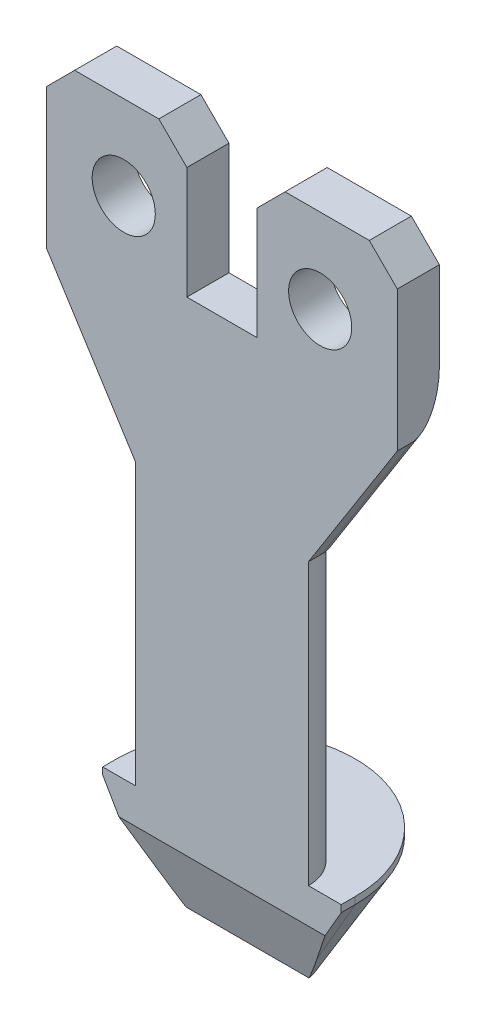
ISO-10303-21;
HEADER;
FILE_DESCRIPTION(('STEP AP214'),'2;1');
FILE_NAME('part.step','',(''),(''),'','','');
FILE_SCHEMA(('AUTOMOTIVE_DESIGN { 1 0 10303 214 1 1 1 1 }'));
ENDSEC;
DATA;
#1=APPLICATION_CONTEXT('core data for automotive mechanical design processes');
#2=APPLICATION_PROTOCOL_DEFINITION('international standard','automotive_design',2000,#1);
#3=PRODUCT_CONTEXT('',#1,'mechanical');
#4=PRODUCT('Part','Part','',(#3));
#5=PRODUCT_RELATED_PRODUCT_CATEGORY('part','',(#4));
#6=PRODUCT_DEFINITION_FORMATION('','',#4);
#7=PRODUCT_DEFINITION_CONTEXT('part definition',#1,'design');
#8=PRODUCT_DEFINITION('design','',#6,#7);
#9=PRODUCT_DEFINITION_SHAPE('','',#8);
#10=(LENGTH_UNIT() NAMED_UNIT(*) SI_UNIT(.MILLI.,.METRE.));
#11=(NAMED_UNIT(*) PLANE_ANGLE_UNIT() SI_UNIT($,.RADIAN.));
#12=(NAMED_UNIT(*) SI_UNIT($,.STERADIAN.) SOLID_ANGLE_UNIT());
#13=UNCERTAINTY_MEASURE_WITH_UNIT(LENGTH_MEASURE(1.E-05),#10,'distance_accuracy_value','');
#14=(GEOMETRIC_REPRESENTATION_CONTEXT(3) GLOBAL_UNCERTAINTY_ASSIGNED_CONTEXT((#13)) GLOBAL_UNIT_ASSIGNED_CONTEXT((#10,
#11,#12)) REPRESENTATION_CONTEXT('',''));
#15=CARTESIAN_POINT('',(0.,0.,0.));
#16=DIRECTION('',(0.,0.,1.));
#17=DIRECTION('',(1.,0.,0.));
#18=AXIS2_PLACEMENT_3D('',#15,#16,#17);
#19=CARTESIAN_POINT('',(0.,0.,3.));
#20=DIRECTION('',(0.,0.,-1.));
#21=DIRECTION('',(-1.,0.,0.));
#22=AXIS2_PLACEMENT_3D('',#19,#20,#21);
#23=PLANE('',#22);
#24=DIRECTION('',(0.,1.,0.));
#25=VECTOR('',#24,1.);
#26=CARTESIAN_POINT('',(5.68511481611491,-37.0594140712138,3.));
#27=LINE('',#26,#25);
#28=CARTESIAN_POINT('',(5.68511481611491,-37.0594140712138,3.));
#29=VERTEX_POINT('',#28);
#30=CARTESIAN_POINT('',(5.68511481611491,-17.0594140712138,3.));
#31=VERTEX_POINT('',#30);
#32=EDGE_CURVE('E243',#29,#31,#27,.T.);
#33=ORIENTED_EDGE('',*,*,#32,.T.);
#34=DIRECTION('',(0.535052081184345,0.844819075554229,0.));
#35=VECTOR('',#34,1.);
#36=CARTESIAN_POINT('',(5.6851148161149,-17.0594140712138,3.));
#37=LINE('',#36,#35);
#38=CARTESIAN_POINT('',(12.0184481494482,-7.05941407121384,3.));
#39=VERTEX_POINT('',#38);
#40=EDGE_CURVE('E225',#31,#39,#37,.T.);
#41=ORIENTED_EDGE('',*,*,#40,.T.);
#42=DIRECTION('',(0.,1.,0.));
#43=VECTOR('',#42,1.);
#44=CARTESIAN_POINT('',(12.0184481494482,-7.05941407121384,3.));
#45=LINE('',#44,#43);
#46=CARTESIAN_POINT('',(12.0184481494482,2.94058592878616,3.));
#47=VERTEX_POINT('',#46);
#48=EDGE_CURVE('E239',#39,#47,#45,.T.);
#49=ORIENTED_EDGE('',*,*,#48,.T.);
#50=DIRECTION('',(0.707106781186546,-0.707106781186549,0.));
#51=VECTOR('',#50,1.);
#52=CARTESIAN_POINT('',(10.0184481494482,4.94058592878616,3.));
#53=LINE('',#52,#51);
#54=CARTESIAN_POINT('',(10.0184481494482,4.94058592878616,3.));
#55=VERTEX_POINT('',#54);
#56=EDGE_CURVE('E436',#47,#55,#53,.F.);
#57=ORIENTED_EDGE('',*,*,#56,.T.);
#58=DIRECTION('',(-1.,0.,0.));
#59=VECTOR('',#58,1.);
#60=CARTESIAN_POINT('',(12.0184481494482,4.94058592878616,3.));
#61=LINE('',#60,#59);
#62=CARTESIAN_POINT('',(4.01844814944825,4.94058592878616,3.));
#63=VERTEX_POINT('',#62);
#64=EDGE_CURVE('E233',#55,#63,#61,.T.);
#65=ORIENTED_EDGE('',*,*,#64,.T.);
#66=DIRECTION('',(0.707106781186549,0.707106781186546,0.));
#67=VECTOR('',#66,1.);
#68=CARTESIAN_POINT('',(2.01844814944824,2.94058592878616,3.));
#69=LINE('',#68,#67);
#70=CARTESIAN_POINT('',(2.01844814944824,2.94058592878616,3.));
#71=VERTEX_POINT('',#70);
#72=EDGE_CURVE('E442',#63,#71,#69,.F.);
#73=ORIENTED_EDGE('',*,*,#72,.T.);
#74=DIRECTION('',(0.,-1.,0.));
#75=VECTOR('',#74,1.);
#76=CARTESIAN_POINT('',(2.01844814944824,4.94058592878616,3.));
#77=LINE('',#76,#75);
#78=CARTESIAN_POINT('',(2.01844814944824,-5.05941407121401,3.));
#79=VERTEX_POINT('',#78);
#80=EDGE_CURVE('E287',#71,#79,#77,.T.);
#81=ORIENTED_EDGE('',*,*,#80,.T.);
#82=DIRECTION('',(-1.,0.,0.));
#83=VECTOR('',#82,1.);
#84=CARTESIAN_POINT('',(2.01844814944824,-5.05941407121401,3.));
#85=LINE('',#84,#83);
#86=CARTESIAN_POINT('',(-2.98155185055176,-5.05941407121401,3.));
#87=VERTEX_POINT('',#86);
#88=EDGE_CURVE('E411',#79,#87,#85,.T.);
#89=ORIENTED_EDGE('',*,*,#88,.T.);
#90=DIRECTION('',(0.,1.,0.));
#91=VECTOR('',#90,1.);
#92=CARTESIAN_POINT('',(-2.98155185055176,-5.05941407121401,3.));
#93=LINE('',#92,#91);
#94=CARTESIAN_POINT('',(-2.98155185055176,2.94058592878616,3.));
#95=VERTEX_POINT('',#94);
#96=EDGE_CURVE('E414',#87,#95,#93,.T.);
#97=ORIENTED_EDGE('',*,*,#96,.T.);
#98=DIRECTION('',(0.707106781186545,-0.70710678118655,0.));
#99=VECTOR('',#98,1.);
#100=CARTESIAN_POINT('',(-4.98155185055176,4.94058592878616,3.));
#101=LINE('',#100,#99);
#102=CARTESIAN_POINT('',(-4.98155185055176,4.94058592878616,3.));
#103=VERTEX_POINT('',#102);
#104=EDGE_CURVE('E424',#95,#103,#101,.F.);
#105=ORIENTED_EDGE('',*,*,#104,.T.);
#106=DIRECTION('',(-1.,0.,0.));
#107=VECTOR('',#106,1.);
#108=CARTESIAN_POINT('',(-2.98155185055176,4.94058592878616,3.));
#109=LINE('',#108,#107);
#110=CARTESIAN_POINT('',(-10.9815518505518,4.94058592878616,3.));
#111=VERTEX_POINT('',#110);
#112=EDGE_CURVE('E259',#103,#111,#109,.T.);
#113=ORIENTED_EDGE('',*,*,#112,.T.);
#114=DIRECTION('',(0.707106781186549,0.707106781186546,0.));
#115=VECTOR('',#114,1.);
#116=CARTESIAN_POINT('',(-12.9815518505518,2.94058592878617,3.));
#117=LINE('',#116,#115);
#118=CARTESIAN_POINT('',(-12.9815518505518,2.94058592878617,3.));
#119=VERTEX_POINT('',#118);
#120=EDGE_CURVE('E421',#111,#119,#117,.F.);
#121=ORIENTED_EDGE('',*,*,#120,.T.);
#122=DIRECTION('',(0.,-1.,0.));
#123=VECTOR('',#122,1.);
#124=CARTESIAN_POINT('',(-12.9815518505518,4.94058592878616,3.));
#125=LINE('',#124,#123);
#126=CARTESIAN_POINT('',(-12.9815518505518,-7.05941407121384,3.));
#127=VERTEX_POINT('',#126);
#128=EDGE_CURVE('E252',#119,#127,#125,.T.);
#129=ORIENTED_EDGE('',*,*,#128,.T.);
#130=DIRECTION('',(0.535052081184345,-0.844819075554229,0.));
#131=VECTOR('',#130,1.);
#132=CARTESIAN_POINT('',(-12.9815518505518,-7.05941407121384,3.));
#133=LINE('',#132,#131);
#134=CARTESIAN_POINT('',(-6.64821851721843,-17.0594140712138,3.));
#135=VERTEX_POINT('',#134);
#136=EDGE_CURVE('E246',#127,#135,#133,.T.);
#137=ORIENTED_EDGE('',*,*,#136,.T.);
#138=DIRECTION('',(0.,-1.,0.));
#139=VECTOR('',#138,1.);
#140=CARTESIAN_POINT('',(-6.64821851721843,-37.0594140712138,3.));
#141=LINE('',#140,#139);
#142=CARTESIAN_POINT('',(-6.64821851721843,-37.0594140712138,3.));
#143=VERTEX_POINT('',#142);
#144=EDGE_CURVE('E326',#135,#143,#141,.T.);
#145=ORIENTED_EDGE('',*,*,#144,.T.);
#146=DIRECTION('',(-1.,0.,0.));
#147=VECTOR('',#146,1.);
#148=CARTESIAN_POINT('',(-6.64821851721843,-37.0594140712138,3.));
#149=LINE('',#148,#147);
#150=CARTESIAN_POINT('',(-8.98155185055176,-37.0594140712138,3.));
#151=VERTEX_POINT('',#150);
#152=EDGE_CURVE('E614',#143,#151,#149,.T.);
#153=ORIENTED_EDGE('',*,*,#152,.T.);
#154=DIRECTION('',(0.,1.,0.));
#155=VECTOR('',#154,1.);
#156=CARTESIAN_POINT('',(-8.98155185055176,-44.5594140712138,3.));
#157=LINE('',#156,#155);
#158=CARTESIAN_POINT('',(-8.98155185055176,-37.5594140712138,3.));
#159=VERTEX_POINT('',#158);
#160=EDGE_CURVE('E378',#159,#151,#157,.T.);
#161=ORIENTED_EDGE('',*,*,#160,.F.);
#162=DIRECTION('',(0.499999999999997,-0.86602540378444,0.));
#163=VECTOR('',#162,1.);
#164=CARTESIAN_POINT('',(-4.94009996622441,-44.5594140712138,3.));
#165=LINE('',#164,#163);
#166=CARTESIAN_POINT('',(-7.82685131217254,-39.5594140712138,3.));
#167=VERTEX_POINT('',#166);
#168=EDGE_CURVE('E310',#159,#167,#165,.T.);
#169=ORIENTED_EDGE('',*,*,#168,.T.);
#170=DIRECTION('',(1.,0.,0.));
#171=VECTOR('',#170,1.);
#172=CARTESIAN_POINT('',(3.97699626512088,-39.5594140712138,3.));
#173=LINE('',#172,#171);
#174=CARTESIAN_POINT('',(6.86374761106902,-39.5594140712138,3.));
#175=VERTEX_POINT('',#174);
#176=EDGE_CURVE('E576',#167,#175,#173,.T.);
#177=ORIENTED_EDGE('',*,*,#176,.T.);
#178=DIRECTION('',(0.499999999999997,0.86602540378444,0.));
#179=VECTOR('',#178,1.);
#180=CARTESIAN_POINT('',(3.97699626512088,-44.5594140712138,3.));
#181=LINE('',#180,#179);
#182=CARTESIAN_POINT('',(8.01844814944824,-37.5594140712138,3.));
#183=VERTEX_POINT('',#182);
#184=EDGE_CURVE('E307',#175,#183,#181,.T.);
#185=ORIENTED_EDGE('',*,*,#184,.T.);
#186=DIRECTION('',(0.,1.,0.));
#187=VECTOR('',#186,1.);
#188=CARTESIAN_POINT('',(8.01844814944824,-44.5594140712138,3.));
#189=LINE('',#188,#187);
#190=CARTESIAN_POINT('',(8.01844814944824,-37.0594140712138,3.));
#191=VERTEX_POINT('',#190);
#192=EDGE_CURVE('E382',#183,#191,#189,.T.);
#193=ORIENTED_EDGE('',*,*,#192,.T.);
#194=DIRECTION('',(-1.,0.,0.));
#195=VECTOR('',#194,1.);
#196=CARTESIAN_POINT('',(5.68511481611491,-37.0594140712138,3.));
#197=LINE('',#196,#195);
#198=EDGE_CURVE('E353',#191,#29,#197,.T.);
#199=ORIENTED_EDGE('',*,*,#198,.T.);
#200=EDGE_LOOP('',(#33,#41,#49,#57,#65,#73,#81,#89,#97,#105,#113,#121,#129,#137,#145,#153,#161,
#169,#177,#185,#193,#199));
#201=FACE_BOUND('',#200,.T.);
#202=CARTESIAN_POINT('',(6.51844814944824,-1.05941407121384,3.));
#203=DIRECTION('',(0.,0.,1.));
#204=DIRECTION('',(1.,0.,0.));
#205=AXIS2_PLACEMENT_3D('',#202,#203,#204);
#206=CIRCLE('',#205,2.25);
#207=CARTESIAN_POINT('',(8.76844814944824,-1.05941407121384,3.));
#208=VERTEX_POINT('',#207);
#209=EDGE_CURVE('E267',#208,#208,#206,.T.);
#210=ORIENTED_EDGE('',*,*,#209,.F.);
#211=EDGE_LOOP('',(#210));
#212=FACE_BOUND('',#211,.T.);
#213=CARTESIAN_POINT('',(-7.48155185055176,-1.05941407121384,3.));
#214=DIRECTION('',(0.,0.,1.));
#215=DIRECTION('',(1.,0.,0.));
#216=AXIS2_PLACEMENT_3D('',#213,#214,#215);
#217=CIRCLE('',#216,2.25);
#218=CARTESIAN_POINT('',(-5.23155185055176,-1.05941407121384,3.));
#219=VERTEX_POINT('',#218);
#220=EDGE_CURVE('E395',#219,#219,#217,.T.);
#221=ORIENTED_EDGE('',*,*,#220,.F.);
#222=EDGE_LOOP('',(#221));
#223=FACE_BOUND('',#222,.T.);
#224=ADVANCED_FACE('F47',(#201,#212,#223),#23,.F.);
#225=CARTESIAN_POINT('',(0.,0.,0.));
#226=DIRECTION('',(0.,0.,-1.));
#227=DIRECTION('',(-1.,0.,0.));
#228=AXIS2_PLACEMENT_3D('',#225,#226,#227);
#229=PLANE('',#228);
#230=DIRECTION('',(0.,1.,0.));
#231=VECTOR('',#230,1.);
#232=CARTESIAN_POINT('',(12.0184481494482,-7.05941407121384,0.));
#233=LINE('',#232,#231);
#234=CARTESIAN_POINT('',(12.0184481494482,-3.32146019656863,0.));
#235=VERTEX_POINT('',#234);
#236=CARTESIAN_POINT('',(12.0184481494482,2.94058592878616,0.));
#237=VERTEX_POINT('',#236);
#238=EDGE_CURVE('E281',#235,#237,#233,.T.);
#239=ORIENTED_EDGE('',*,*,#238,.F.);
#240=DIRECTION('',(0.535052081184345,0.844819075554229,0.));
#241=VECTOR('',#240,1.);
#242=CARTESIAN_POINT('',(3.99547666500644,-15.9893099088451,0.));
#243=LINE('',#242,#241);
#244=CARTESIAN_POINT('',(3.31774402883961,-17.0594140712138,0.));
#245=VERTEX_POINT('',#244);
#246=EDGE_CURVE('E593',#235,#245,#243,.F.);
#247=ORIENTED_EDGE('',*,*,#246,.T.);
#248=DIRECTION('',(1.,0.,0.));
#249=VECTOR('',#248,1.);
#250=CARTESIAN_POINT('',(5.68511481611491,-17.0594140712138,0.));
#251=LINE('',#250,#249);
#252=CARTESIAN_POINT('',(2.68511481611491,-17.0594140712138,0.));
#253=VERTEX_POINT('',#252);
#254=EDGE_CURVE('E358',#253,#245,#251,.T.);
#255=ORIENTED_EDGE('',*,*,#254,.F.);
#256=DIRECTION('',(0.,1.,0.));
#257=VECTOR('',#256,1.);
#258=CARTESIAN_POINT('',(2.68511481611491,-37.0594140712138,0.));
#259=LINE('',#258,#257);
#260=CARTESIAN_POINT('',(2.68511481611491,-37.0594140712138,0.));
#261=VERTEX_POINT('',#260);
#262=EDGE_CURVE('E334',#253,#261,#259,.F.);
#263=ORIENTED_EDGE('',*,*,#262,.T.);
#264=DIRECTION('',(1.,0.,0.));
#265=VECTOR('',#264,1.);
#266=CARTESIAN_POINT('',(-8.98155185055176,-37.0594140712138,0.));
#267=LINE('',#266,#265);
#268=CARTESIAN_POINT('',(-3.64821851721843,-37.0594140712138,0.));
#269=VERTEX_POINT('',#268);
#270=EDGE_CURVE('E389',#269,#261,#267,.T.);
#271=ORIENTED_EDGE('',*,*,#270,.F.);
#272=DIRECTION('',(0.,-1.,0.));
#273=VECTOR('',#272,1.);
#274=CARTESIAN_POINT('',(-3.64821851721843,-17.0594140712138,0.));
#275=LINE('',#274,#273);
#276=CARTESIAN_POINT('',(-3.64821851721843,-17.0594140712138,0.));
#277=VERTEX_POINT('',#276);
#278=EDGE_CURVE('E320',#269,#277,#275,.F.);
#279=ORIENTED_EDGE('',*,*,#278,.T.);
#280=DIRECTION('',(1.,0.,0.));
#281=VECTOR('',#280,1.);
#282=CARTESIAN_POINT('',(-6.64821851721843,-17.0594140712138,0.));
#283=LINE('',#282,#281);
#284=CARTESIAN_POINT('',(-4.28084772994314,-17.0594140712138,0.));
#285=VERTEX_POINT('',#284);
#286=EDGE_CURVE('E605',#285,#277,#283,.T.);
#287=ORIENTED_EDGE('',*,*,#286,.F.);
#288=DIRECTION('',(0.535052081184345,-0.844819075554229,0.));
#289=VECTOR('',#288,1.);
#290=CARTESIAN_POINT('',(-11.2919136994433,-5.98930990884515,0.));
#291=LINE('',#290,#289);
#292=CARTESIAN_POINT('',(-12.9815518505518,-3.32146019656863,0.));
#293=VERTEX_POINT('',#292);
#294=EDGE_CURVE('E590',#285,#293,#291,.F.);
#295=ORIENTED_EDGE('',*,*,#294,.T.);
#296=DIRECTION('',(0.,-1.,0.));
#297=VECTOR('',#296,1.);
#298=CARTESIAN_POINT('',(-12.9815518505518,4.94058592878616,0.));
#299=LINE('',#298,#297);
#300=CARTESIAN_POINT('',(-12.9815518505518,2.94058592878617,0.));
#301=VERTEX_POINT('',#300);
#302=EDGE_CURVE('E278',#301,#293,#299,.T.);
#303=ORIENTED_EDGE('',*,*,#302,.F.);
#304=DIRECTION('',(-0.707106781186549,-0.707106781186546,0.));
#305=VECTOR('',#304,1.);
#306=CARTESIAN_POINT('',(-7.96106888966894,7.96106888966897,0.));
#307=LINE('',#306,#305);
#308=CARTESIAN_POINT('',(-10.9815518505518,4.94058592878616,0.));
#309=VERTEX_POINT('',#308);
#310=EDGE_CURVE('E644',#301,#309,#307,.F.);
#311=ORIENTED_EDGE('',*,*,#310,.T.);
#312=DIRECTION('',(-1.,0.,0.));
#313=VECTOR('',#312,1.);
#314=CARTESIAN_POINT('',(-2.98155185055176,4.94058592878616,0.));
#315=LINE('',#314,#313);
#316=CARTESIAN_POINT('',(-4.98155185055176,4.94058592878616,0.));
#317=VERTEX_POINT('',#316);
#318=EDGE_CURVE('E274',#317,#309,#315,.T.);
#319=ORIENTED_EDGE('',*,*,#318,.F.);
#320=DIRECTION('',(-0.707106781186545,0.70710678118655,0.));
#321=VECTOR('',#320,1.);
#322=CARTESIAN_POINT('',(-0.0204829608828132,-0.0204829608828131,0.));
#323=LINE('',#322,#321);
#324=CARTESIAN_POINT('',(-2.98155185055176,2.94058592878616,0.));
#325=VERTEX_POINT('',#324);
#326=EDGE_CURVE('E657',#317,#325,#323,.F.);
#327=ORIENTED_EDGE('',*,*,#326,.T.);
#328=DIRECTION('',(0.,1.,0.));
#329=VECTOR('',#328,1.);
#330=CARTESIAN_POINT('',(-2.98155185055176,-5.05941407121401,0.));
#331=LINE('',#330,#329);
#332=CARTESIAN_POINT('',(-2.98155185055176,-5.05941407121401,0.));
#333=VERTEX_POINT('',#332);
#334=EDGE_CURVE('E270',#333,#325,#331,.T.);
#335=ORIENTED_EDGE('',*,*,#334,.F.);
#336=DIRECTION('',(-1.,0.,0.));
#337=VECTOR('',#336,1.);
#338=CARTESIAN_POINT('',(2.01844814944824,-5.05941407121401,0.));
#339=LINE('',#338,#337);
#340=CARTESIAN_POINT('',(2.01844814944824,-5.05941407121401,0.));
#341=VERTEX_POINT('',#340);
#342=EDGE_CURVE('E266',#341,#333,#339,.T.);
#343=ORIENTED_EDGE('',*,*,#342,.F.);
#344=DIRECTION('',(0.,-1.,0.));
#345=VECTOR('',#344,1.);
#346=CARTESIAN_POINT('',(2.01844814944824,4.94058592878616,0.));
#347=LINE('',#346,#345);
#348=CARTESIAN_POINT('',(2.01844814944824,2.94058592878616,0.));
#349=VERTEX_POINT('',#348);
#350=EDGE_CURVE('E263',#349,#341,#347,.T.);
#351=ORIENTED_EDGE('',*,*,#350,.F.);
#352=DIRECTION('',(-0.707106781186549,-0.707106781186546,0.));
#353=VECTOR('',#352,1.);
#354=CARTESIAN_POINT('',(-0.461068889668967,0.461068889668969,0.));
#355=LINE('',#354,#353);
#356=CARTESIAN_POINT('',(4.01844814944825,4.94058592878616,0.));
#357=VERTEX_POINT('',#356);
#358=EDGE_CURVE('E625',#349,#357,#355,.F.);
#359=ORIENTED_EDGE('',*,*,#358,.T.);
#360=DIRECTION('',(-1.,0.,0.));
#361=VECTOR('',#360,1.);
#362=CARTESIAN_POINT('',(12.0184481494482,4.94058592878616,0.));
#363=LINE('',#362,#361);
#364=CARTESIAN_POINT('',(10.0184481494482,4.94058592878616,0.));
#365=VERTEX_POINT('',#364);
#366=EDGE_CURVE('E284',#365,#357,#363,.T.);
#367=ORIENTED_EDGE('',*,*,#366,.F.);
#368=DIRECTION('',(-0.707106781186546,0.707106781186549,0.));
#369=VECTOR('',#368,1.);
#370=CARTESIAN_POINT('',(7.47951703911722,7.47951703911719,0.));
#371=LINE('',#370,#369);
#372=EDGE_CURVE('E640',#365,#237,#371,.F.);
#373=ORIENTED_EDGE('',*,*,#372,.T.);
#374=EDGE_LOOP('',(#239,#247,#255,#263,#271,#279,#287,#295,#303,#311,#319,#327,#335,#343,#351,
#359,#367,#373));
#375=FACE_BOUND('',#374,.T.);
#376=CARTESIAN_POINT('',(6.51844814944824,-1.05941407121384,0.));
#377=DIRECTION('',(0.,0.,1.));
#378=DIRECTION('',(1.,0.,0.));
#379=AXIS2_PLACEMENT_3D('',#376,#377,#378);
#380=CIRCLE('',#379,2.25);
#381=CARTESIAN_POINT('',(8.76844814944824,-1.05941407121384,0.));
#382=VERTEX_POINT('',#381);
#383=EDGE_CURVE('E399',#382,#382,#380,.T.);
#384=ORIENTED_EDGE('',*,*,#383,.T.);
#385=EDGE_LOOP('',(#384));
#386=FACE_BOUND('',#385,.T.);
#387=CARTESIAN_POINT('',(-7.48155185055176,-1.05941407121384,0.));
#388=DIRECTION('',(0.,0.,1.));
#389=DIRECTION('',(1.,0.,0.));
#390=AXIS2_PLACEMENT_3D('',#387,#388,#389);
#391=CIRCLE('',#390,2.25);
#392=CARTESIAN_POINT('',(-5.23155185055176,-1.05941407121384,0.));
#393=VERTEX_POINT('',#392);
#394=EDGE_CURVE('E394',#393,#393,#391,.T.);
#395=ORIENTED_EDGE('',*,*,#394,.T.);
#396=EDGE_LOOP('',(#395));
#397=FACE_BOUND('',#396,.T.);
#398=ADVANCED_FACE('F516',(#375,#386,#397),#229,.T.);
#399=CARTESIAN_POINT('',(2.01844814944824,4.94058592878616,3.));
#400=DIRECTION('',(1.,0.,0.));
#401=DIRECTION('',(0.,0.,-1.));
#402=AXIS2_PLACEMENT_3D('',#399,#400,#401);
#403=PLANE('',#402);
#404=ORIENTED_EDGE('',*,*,#80,.F.);
#405=DIRECTION('',(0.,0.,-1.));
#406=VECTOR('',#405,1.);
#407=CARTESIAN_POINT('',(2.01844814944824,2.94058592878616,3.));
#408=LINE('',#407,#406);
#409=EDGE_CURVE('E464',#71,#349,#408,.T.);
#410=ORIENTED_EDGE('',*,*,#409,.T.);
#411=ORIENTED_EDGE('',*,*,#350,.T.);
#412=DIRECTION('',(0.,0.,-1.));
#413=VECTOR('',#412,1.);
#414=CARTESIAN_POINT('',(2.01844814944824,-5.05941407121401,3.));
#415=LINE('',#414,#413);
#416=EDGE_CURVE('E295',#79,#341,#415,.T.);
#417=ORIENTED_EDGE('',*,*,#416,.F.);
#418=EDGE_LOOP('',(#404,#410,#411,#417));
#419=FACE_BOUND('',#418,.T.);
#420=ADVANCED_FACE('F521',(#419),#403,.F.);
#421=CARTESIAN_POINT('',(2.01844814944824,-5.05941407121401,3.));
#422=DIRECTION('',(0.,-1.,0.));
#423=DIRECTION('',(0.,0.,-1.));
#424=AXIS2_PLACEMENT_3D('',#421,#422,#423);
#425=PLANE('',#424);
#426=ORIENTED_EDGE('',*,*,#342,.T.);
#427=DIRECTION('',(0.,0.,-1.));
#428=VECTOR('',#427,1.);
#429=CARTESIAN_POINT('',(-2.98155185055176,-5.05941407121401,3.));
#430=LINE('',#429,#428);
#431=EDGE_CURVE('E291',#87,#333,#430,.T.);
#432=ORIENTED_EDGE('',*,*,#431,.F.);
#433=ORIENTED_EDGE('',*,*,#88,.F.);
#434=ORIENTED_EDGE('',*,*,#416,.T.);
#435=EDGE_LOOP('',(#426,#432,#433,#434));
#436=FACE_BOUND('',#435,.T.);
#437=ADVANCED_FACE('F543',(#436),#425,.F.);
#438=CARTESIAN_POINT('',(-2.98155185055176,-5.05941407121401,3.));
#439=DIRECTION('',(-1.,0.,0.));
#440=DIRECTION('',(0.,-1.,0.));
#441=AXIS2_PLACEMENT_3D('',#438,#439,#440);
#442=PLANE('',#441);
#443=ORIENTED_EDGE('',*,*,#334,.T.);
#444=DIRECTION('',(0.,0.,1.));
#445=VECTOR('',#444,1.);
#446=CARTESIAN_POINT('',(-2.98155185055176,2.94058592878616,3.));
#447=LINE('',#446,#445);
#448=EDGE_CURVE('E461',#325,#95,#447,.T.);
#449=ORIENTED_EDGE('',*,*,#448,.T.);
#450=ORIENTED_EDGE('',*,*,#96,.F.);
#451=ORIENTED_EDGE('',*,*,#431,.T.);
#452=EDGE_LOOP('',(#443,#449,#450,#451));
#453=FACE_BOUND('',#452,.T.);
#454=ADVANCED_FACE('F540',(#453),#442,.F.);
#455=CARTESIAN_POINT('',(-2.98155185055176,4.94058592878616,3.));
#456=DIRECTION('',(0.,-1.,0.));
#457=DIRECTION('',(0.,0.,-1.));
#458=AXIS2_PLACEMENT_3D('',#455,#456,#457);
#459=PLANE('',#458);
#460=ORIENTED_EDGE('',*,*,#318,.T.);
#461=DIRECTION('',(0.,0.,1.));
#462=VECTOR('',#461,1.);
#463=CARTESIAN_POINT('',(-10.9815518505518,4.94058592878616,3.));
#464=LINE('',#463,#462);
#465=EDGE_CURVE('E432',#309,#111,#464,.T.);
#466=ORIENTED_EDGE('',*,*,#465,.T.);
#467=ORIENTED_EDGE('',*,*,#112,.F.);
#468=DIRECTION('',(0.,0.,-1.));
#469=VECTOR('',#468,1.);
#470=CARTESIAN_POINT('',(-4.98155185055176,4.94058592878616,3.));
#471=LINE('',#470,#469);
#472=EDGE_CURVE('E456',#103,#317,#471,.T.);
#473=ORIENTED_EDGE('',*,*,#472,.T.);
#474=EDGE_LOOP('',(#460,#466,#467,#473));
#475=FACE_BOUND('',#474,.T.);
#476=ADVANCED_FACE('F537',(#475),#459,.F.);
#477=CARTESIAN_POINT('',(-12.9815518505518,4.94058592878616,3.));
#478=DIRECTION('',(1.,0.,0.));
#479=DIRECTION('',(0.,0.,-1.));
#480=AXIS2_PLACEMENT_3D('',#477,#478,#479);
#481=PLANE('',#480);
#482=ORIENTED_EDGE('',*,*,#302,.T.);
#483=CARTESIAN_POINT('',(-12.9815518505518,-3.32146019656863,2.));
#484=DIRECTION('',(1.,0.,0.));
#485=DIRECTION('',(0.,1.,0.));
#486=AXIS2_PLACEMENT_3D('',#483,#484,#485);
#487=ELLIPSE('',#486,3.7379538746452,2.);
#488=CARTESIAN_POINT('',(-12.9815518505518,-7.05941407121384,2.));
#489=VERTEX_POINT('',#488);
#490=EDGE_CURVE('E12',#293,#489,#487,.F.);
#491=ORIENTED_EDGE('',*,*,#490,.T.);
#492=DIRECTION('',(0.,0.,-1.));
#493=VECTOR('',#492,1.);
#494=CARTESIAN_POINT('',(-12.9815518505518,-7.05941407121384,3.));
#495=LINE('',#494,#493);
#496=EDGE_CURVE('E232',#127,#489,#495,.T.);
#497=ORIENTED_EDGE('',*,*,#496,.F.);
#498=ORIENTED_EDGE('',*,*,#128,.F.);
#499=DIRECTION('',(0.,0.,-1.));
#500=VECTOR('',#499,1.);
#501=CARTESIAN_POINT('',(-12.9815518505518,2.94058592878617,3.));
#502=LINE('',#501,#500);
#503=EDGE_CURVE('E434',#119,#301,#502,.T.);
#504=ORIENTED_EDGE('',*,*,#503,.T.);
#505=EDGE_LOOP('',(#482,#491,#497,#498,#504));
#506=FACE_BOUND('',#505,.T.);
#507=ADVANCED_FACE('F534',(#506),#481,.F.);
#508=CARTESIAN_POINT('',(12.0184481494482,-7.05941407121384,3.));
#509=DIRECTION('',(-1.,0.,0.));
#510=DIRECTION('',(0.,0.,1.));
#511=AXIS2_PLACEMENT_3D('',#508,#509,#510);
#512=PLANE('',#511);
#513=DIRECTION('',(0.,0.,-1.));
#514=VECTOR('',#513,1.);
#515=CARTESIAN_POINT('',(12.0184481494482,-7.05941407121384,3.));
#516=LINE('',#515,#514);
#517=CARTESIAN_POINT('',(12.0184481494482,-7.05941407121384,2.));
#518=VERTEX_POINT('',#517);
#519=EDGE_CURVE('E221',#39,#518,#516,.T.);
#520=ORIENTED_EDGE('',*,*,#519,.T.);
#521=CARTESIAN_POINT('',(12.0184481494482,-3.32146019656863,2.));
#522=DIRECTION('',(-1.,0.,0.));
#523=DIRECTION('',(0.,-1.,0.));
#524=AXIS2_PLACEMENT_3D('',#521,#522,#523);
#525=ELLIPSE('',#524,3.7379538746452,2.);
#526=EDGE_CURVE('E587',#518,#235,#525,.F.);
#527=ORIENTED_EDGE('',*,*,#526,.T.);
#528=ORIENTED_EDGE('',*,*,#238,.T.);
#529=DIRECTION('',(0.,0.,1.));
#530=VECTOR('',#529,1.);
#531=CARTESIAN_POINT('',(12.0184481494482,2.94058592878616,3.));
#532=LINE('',#531,#530);
#533=EDGE_CURVE('E250',#237,#47,#532,.T.);
#534=ORIENTED_EDGE('',*,*,#533,.T.);
#535=ORIENTED_EDGE('',*,*,#48,.F.);
#536=EDGE_LOOP('',(#520,#527,#528,#534,#535));
#537=FACE_BOUND('',#536,.T.);
#538=ADVANCED_FACE('F248',(#537),#512,.F.);
#539=CARTESIAN_POINT('',(12.0184481494482,4.94058592878616,3.));
#540=DIRECTION('',(0.,-1.,0.));
#541=DIRECTION('',(0.,0.,-1.));
#542=AXIS2_PLACEMENT_3D('',#539,#540,#541);
#543=PLANE('',#542);
#544=ORIENTED_EDGE('',*,*,#64,.F.);
#545=DIRECTION('',(0.,0.,-1.));
#546=VECTOR('',#545,1.);
#547=CARTESIAN_POINT('',(10.0184481494482,4.94058592878616,3.));
#548=LINE('',#547,#546);
#549=EDGE_CURVE('E448',#55,#365,#548,.T.);
#550=ORIENTED_EDGE('',*,*,#549,.T.);
#551=ORIENTED_EDGE('',*,*,#366,.T.);
#552=DIRECTION('',(0.,0.,1.));
#553=VECTOR('',#552,1.);
#554=CARTESIAN_POINT('',(4.01844814944825,4.94058592878616,3.));
#555=LINE('',#554,#553);
#556=EDGE_CURVE('E440',#357,#63,#555,.T.);
#557=ORIENTED_EDGE('',*,*,#556,.T.);
#558=EDGE_LOOP('',(#544,#550,#551,#557));
#559=FACE_BOUND('',#558,.T.);
#560=ADVANCED_FACE('F528',(#559),#543,.F.);
#561=CARTESIAN_POINT('',(6.51844814944824,-1.05941407121384,3.));
#562=DIRECTION('',(0.,0.,-1.));
#563=DIRECTION('',(-1.,0.,0.));
#564=AXIS2_PLACEMENT_3D('',#561,#562,#563);
#565=CYLINDRICAL_SURFACE('',#564,2.25);
#566=ORIENTED_EDGE('',*,*,#209,.T.);
#567=EDGE_LOOP('',(#566));
#568=FACE_BOUND('',#567,.T.);
#569=ORIENTED_EDGE('',*,*,#383,.F.);
#570=EDGE_LOOP('',(#569));
#571=FACE_BOUND('',#570,.T.);
#572=ADVANCED_FACE('F525',(#568,#571),#565,.F.);
#573=CARTESIAN_POINT('',(-7.48155185055176,-1.05941407121384,3.));
#574=DIRECTION('',(0.,0.,-1.));
#575=DIRECTION('',(-1.,0.,0.));
#576=AXIS2_PLACEMENT_3D('',#573,#574,#575);
#577=CYLINDRICAL_SURFACE('',#576,2.25);
#578=ORIENTED_EDGE('',*,*,#220,.T.);
#579=EDGE_LOOP('',(#578));
#580=FACE_BOUND('',#579,.T.);
#581=ORIENTED_EDGE('',*,*,#394,.F.);
#582=EDGE_LOOP('',(#581));
#583=FACE_BOUND('',#582,.T.);
#584=ADVANCED_FACE('F740',(#580,#583),#577,.F.);
#585=CARTESIAN_POINT('',(-0.481551850551761,-37.0594140712138,2.));
#586=DIRECTION('',(0.,-1.,0.));
#587=DIRECTION('',(0.,0.,-1.));
#588=AXIS2_PLACEMENT_3D('',#585,#586,#587);
#589=PLANE('',#588);
#590=CARTESIAN_POINT('',(-0.481551850551761,-37.0594140712138,2.));
#591=DIRECTION('',(0.,-1.,0.));
#592=DIRECTION('',(0.,0.,-1.));
#593=AXIS2_PLACEMENT_3D('',#590,#591,#592);
#594=CIRCLE('',#593,8.5);
#595=CARTESIAN_POINT('',(-8.98155185055176,-37.0594140712138,2.));
#596=VERTEX_POINT('',#595);
#597=CARTESIAN_POINT('',(8.01844814944824,-37.0594140712138,2.));
#598=VERTEX_POINT('',#597);
#599=EDGE_CURVE('E299',#596,#598,#594,.T.);
#600=ORIENTED_EDGE('',*,*,#599,.F.);
#601=DIRECTION('',(0.,0.,-1.));
#602=VECTOR('',#601,1.);
#603=CARTESIAN_POINT('',(-8.98155185055176,-37.0594140712138,2.));
#604=LINE('',#603,#602);
#605=EDGE_CURVE('E369',#151,#596,#604,.T.);
#606=ORIENTED_EDGE('',*,*,#605,.F.);
#607=ORIENTED_EDGE('',*,*,#152,.F.);
#608=CARTESIAN_POINT('',(-3.64821851721843,-37.0594140712138,3.));
#609=DIRECTION('',(0.,-1.,0.));
#610=DIRECTION('',(0.,0.,-1.));
#611=AXIS2_PLACEMENT_3D('',#608,#609,#610);
#612=CIRCLE('',#611,3.);
#613=EDGE_CURVE('E345',#143,#269,#612,.T.);
#614=ORIENTED_EDGE('',*,*,#613,.T.);
#615=ORIENTED_EDGE('',*,*,#270,.T.);
#616=CARTESIAN_POINT('',(2.68511481611491,-37.0594140712138,3.));
#617=DIRECTION('',(0.,-1.,0.));
#618=DIRECTION('',(0.,0.,-1.));
#619=AXIS2_PLACEMENT_3D('',#616,#617,#618);
#620=CIRCLE('',#619,3.);
#621=EDGE_CURVE('E341',#261,#29,#620,.T.);
#622=ORIENTED_EDGE('',*,*,#621,.T.);
#623=ORIENTED_EDGE('',*,*,#198,.F.);
#624=DIRECTION('',(0.,0.,1.));
#625=VECTOR('',#624,1.);
#626=CARTESIAN_POINT('',(8.01844814944824,-37.0594140712138,3.));
#627=LINE('',#626,#625);
#628=EDGE_CURVE('E330',#598,#191,#627,.T.);
#629=ORIENTED_EDGE('',*,*,#628,.F.);
#630=EDGE_LOOP('',(#600,#606,#607,#614,#615,#622,#623,#629));
#631=FACE_BOUND('',#630,.T.);
#632=ADVANCED_FACE('F719',(#631),#589,.F.);
#633=CARTESIAN_POINT('',(-0.481551850551761,-44.5594140712138,2.));
#634=DIRECTION('',(0.,1.,0.));
#635=DIRECTION('',(0.,0.,1.));
#636=AXIS2_PLACEMENT_3D('',#633,#634,#635);
#637=CYLINDRICAL_SURFACE('',#636,8.5);
#638=DIRECTION('',(0.,1.,0.));
#639=VECTOR('',#638,1.);
#640=CARTESIAN_POINT('',(8.01844814944824,-44.5594140712138,2.));
#641=LINE('',#640,#639);
#642=CARTESIAN_POINT('',(8.01844814944824,-37.5594140712138,2.));
#643=VERTEX_POINT('',#642);
#644=EDGE_CURVE('E386',#643,#598,#641,.T.);
#645=ORIENTED_EDGE('',*,*,#644,.F.);
#646=CARTESIAN_POINT('',(-0.481551850551761,-37.5594140712138,2.));
#647=DIRECTION('',(0.,-1.,0.));
#648=DIRECTION('',(0.,0.,-1.));
#649=AXIS2_PLACEMENT_3D('',#646,#647,#648);
#650=CIRCLE('',#649,8.5);
#651=CARTESIAN_POINT('',(-8.98155185055176,-37.5594140712138,2.));
#652=VERTEX_POINT('',#651);
#653=EDGE_CURVE('E317',#643,#652,#650,.F.);
#654=ORIENTED_EDGE('',*,*,#653,.T.);
#655=DIRECTION('',(0.,1.,0.));
#656=VECTOR('',#655,1.);
#657=CARTESIAN_POINT('',(-8.98155185055176,-44.5594140712138,2.));
#658=LINE('',#657,#656);
#659=EDGE_CURVE('E374',#652,#596,#658,.T.);
#660=ORIENTED_EDGE('',*,*,#659,.T.);
#661=ORIENTED_EDGE('',*,*,#599,.T.);
#662=EDGE_LOOP('',(#645,#654,#660,#661));
#663=FACE_BOUND('',#662,.T.);
#664=ADVANCED_FACE('F715',(#663),#637,.T.);
#665=CARTESIAN_POINT('',(8.01844814944824,-44.5594140712138,3.));
#666=DIRECTION('',(-1.,0.,0.));
#667=DIRECTION('',(0.,0.,1.));
#668=AXIS2_PLACEMENT_3D('',#665,#666,#667);
#669=PLANE('',#668);
#670=ORIENTED_EDGE('',*,*,#192,.F.);
#671=DIRECTION('',(0.,0.,-1.));
#672=VECTOR('',#671,1.);
#673=CARTESIAN_POINT('',(8.01844814944824,-37.5594140712138,2.));
#674=LINE('',#673,#672);
#675=EDGE_CURVE('E314',#183,#643,#674,.T.);
#676=ORIENTED_EDGE('',*,*,#675,.T.);
#677=ORIENTED_EDGE('',*,*,#644,.T.);
#678=ORIENTED_EDGE('',*,*,#628,.T.);
#679=EDGE_LOOP('',(#670,#676,#677,#678));
#680=FACE_BOUND('',#679,.T.);
#681=ADVANCED_FACE('F723',(#680),#669,.F.);
#682=CARTESIAN_POINT('',(-8.98155185055176,-44.5594140712138,2.));
#683=DIRECTION('',(1.,0.,0.));
#684=DIRECTION('',(0.,0.,-1.));
#685=AXIS2_PLACEMENT_3D('',#682,#683,#684);
#686=PLANE('',#685);
#687=ORIENTED_EDGE('',*,*,#659,.F.);
#688=DIRECTION('',(0.,0.,1.));
#689=VECTOR('',#688,1.);
#690=CARTESIAN_POINT('',(-8.98155185055176,-37.5594140712138,3.));
#691=LINE('',#690,#689);
#692=EDGE_CURVE('E304',#652,#159,#691,.T.);
#693=ORIENTED_EDGE('',*,*,#692,.T.);
#694=ORIENTED_EDGE('',*,*,#160,.T.);
#695=ORIENTED_EDGE('',*,*,#605,.T.);
#696=EDGE_LOOP('',(#687,#693,#694,#695));
#697=FACE_BOUND('',#696,.T.);
#698=ADVANCED_FACE('F703',(#697),#686,.F.);
#699=CARTESIAN_POINT('',(-0.481551850551761,-44.5594140712138,2.));
#700=DIRECTION('',(0.,-1.,0.));
#701=DIRECTION('',(0.,0.,-1.));
#702=AXIS2_PLACEMENT_3D('',#699,#700,#701);
#703=PLANE('',#702);
#704=CARTESIAN_POINT('',(-0.481551850551761,-44.5594140712138,2.));
#705=DIRECTION('',(0.,-1.,0.));
#706=DIRECTION('',(0.,0.,-1.));
#707=AXIS2_PLACEMENT_3D('',#704,#705,#706);
#708=CIRCLE('',#707,4.45854811567265);
#709=CARTESIAN_POINT('',(-4.86407342569948,-44.5594140712138,1.18014882866899));
#710=VERTEX_POINT('',#709);
#711=CARTESIAN_POINT('',(3.90096972459596,-44.5594140712138,1.18014882866899));
#712=VERTEX_POINT('',#711);
#713=EDGE_CURVE('E300',#710,#712,#708,.T.);
#714=ORIENTED_EDGE('',*,*,#713,.T.);
#715=DIRECTION('',(-1.,0.,0.));
#716=VECTOR('',#715,1.);
#717=CARTESIAN_POINT('',(-4.94009996622441,-44.5594140712138,1.18014882866899));
#718=LINE('',#717,#716);
#719=EDGE_CURVE('E468',#712,#710,#718,.T.);
#720=ORIENTED_EDGE('',*,*,#719,.T.);
#721=EDGE_LOOP('',(#714,#720));
#722=FACE_BOUND('',#721,.T.);
#723=ADVANCED_FACE('F698',(#722),#703,.T.);
#724=CARTESIAN_POINT('',(3.97699626512088,-44.5594140712138,2.));
#725=DIRECTION('',(0.86602540378444,-0.499999999999997,0.));
#726=DIRECTION('',(0.,0.,-1.));
#727=AXIS2_PLACEMENT_3D('',#724,#725,#726);
#728=PLANE('',#727);
#729=ORIENTED_EDGE('',*,*,#184,.F.);
#730=DIRECTION('',(-0.476870962711472,-0.825964736070558,-0.30062657848322));
#731=VECTOR('',#730,1.);
#732=CARTESIAN_POINT('',(4.09453019946643,-44.3558393253139,1.25424397662488));
#733=LINE('',#732,#731);
#734=CARTESIAN_POINT('',(5.27749078335447,-42.3068914906684,2.));
#735=VERTEX_POINT('',#734);
#736=EDGE_CURVE('E580',#175,#735,#733,.T.);
#737=ORIENTED_EDGE('',*,*,#736,.T.);
#738=DIRECTION('',(-0.499999999999997,-0.86602540378444,0.));
#739=VECTOR('',#738,1.);
#740=CARTESIAN_POINT('',(8.01844814944824,-37.5594140712138,2.));
#741=LINE('',#740,#739);
#742=EDGE_CURVE('E325',#643,#735,#741,.T.);
#743=ORIENTED_EDGE('',*,*,#742,.F.);
#744=ORIENTED_EDGE('',*,*,#675,.F.);
#745=EDGE_LOOP('',(#729,#737,#743,#744));
#746=FACE_BOUND('',#745,.T.);
#747=ADVANCED_FACE('F565',(#746),#728,.T.);
#748=CARTESIAN_POINT('',(-0.481551850551761,-44.5594140712138,2.));
#749=DIRECTION('',(0.,1.,0.));
#750=DIRECTION('',(0.,0.,1.));
#751=AXIS2_PLACEMENT_3D('',#748,#749,#750);
#752=CONICAL_SURFACE('',#751,4.45854811567265,0.523598775598296);
#753=ORIENTED_EDGE('',*,*,#713,.F.);
#754=CARTESIAN_POINT('',(-4.86407342569948,-44.5594140712138,1.18014882866899));
#755=CARTESIAN_POINT('',(-4.98488047898732,-44.3750410706528,1.24725511287553));
#756=CARTESIAN_POINT('',(-5.10381300006642,-44.1895969441273,1.31475125505032));
#757=CARTESIAN_POINT('',(-5.33845906776741,-43.8169632330287,1.45037883417437));
#758=CARTESIAN_POINT('',(-5.45417320374733,-43.6297739765228,1.51851015171693));
#759=CARTESIAN_POINT('',(-5.68294949919129,-43.2539904240196,1.65528417935491));
#760=CARTESIAN_POINT('',(-5.79601182570058,-43.0653962175156,1.7239268568774));
#761=CARTESIAN_POINT('',(-6.01989469071671,-42.6869901965478,1.86165538497682));
#762=CARTESIAN_POINT('',(-6.1307148135827,-42.497178164769,1.93074131464989));
#763=CARTESIAN_POINT('',(-6.24059448445799,-42.3068914906684,2.));
#764=B_SPLINE_CURVE_WITH_KNOTS('',3,(#754,#755,#756,#757,#758,#759,#760,#761,#762,#763),
.UNSPECIFIED.,.F.,.F.,(4,2,2,2,4),(0.,0.691216604697212,1.3823057875314,2.07335131906891,
2.76452379839814),.UNSPECIFIED.);
#765=CARTESIAN_POINT('',(-6.24059448445799,-42.3068914906684,2.));
#766=VERTEX_POINT('',#765);
#767=EDGE_CURVE('E481',#710,#766,#764,.T.);
#768=ORIENTED_EDGE('',*,*,#767,.T.);
#769=DIRECTION('',(0.499999999999997,-0.86602540378444,0.));
#770=VECTOR('',#769,1.);
#771=CARTESIAN_POINT('',(-8.98155185055176,-37.5594140712138,2.));
#772=LINE('',#771,#770);
#773=EDGE_CURVE('E321',#652,#766,#772,.T.);
#774=ORIENTED_EDGE('',*,*,#773,.F.);
#775=ORIENTED_EDGE('',*,*,#653,.F.);
#776=ORIENTED_EDGE('',*,*,#742,.T.);
#777=CARTESIAN_POINT('',(5.27749078335447,-42.3068914906684,2.));
#778=CARTESIAN_POINT('',(5.16761111247918,-42.497178164769,1.93074131464989));
#779=CARTESIAN_POINT('',(5.05679098961318,-42.6869901965478,1.86165538497682));
#780=CARTESIAN_POINT('',(4.83290812459706,-43.0653962175156,1.7239268568774));
#781=CARTESIAN_POINT('',(4.71984579808776,-43.2539904240196,1.65528417935491));
#782=CARTESIAN_POINT('',(4.49106950264381,-43.6297739765228,1.51851015171694));
#783=CARTESIAN_POINT('',(4.37535536666389,-43.8169632330287,1.45037883417438));
#784=CARTESIAN_POINT('',(4.1407092989629,-44.1895969441273,1.31475125505032));
#785=CARTESIAN_POINT('',(4.02177677788379,-44.3750410706528,1.24725511287553));
#786=CARTESIAN_POINT('',(3.90096972459596,-44.5594140712138,1.18014882866899));
#787=B_SPLINE_CURVE_WITH_KNOTS('',3,(#777,#778,#779,#780,#781,#782,#783,#784,#785,#786),
.UNSPECIFIED.,.F.,.F.,(4,2,2,2,4),(0.,0.691172479329244,1.38221801086674,2.07330719370091,
2.76452379839814),.UNSPECIFIED.);
#788=EDGE_CURVE('E472',#735,#712,#787,.T.);
#789=ORIENTED_EDGE('',*,*,#788,.T.);
#790=EDGE_LOOP('',(#753,#768,#774,#775,#776,#789));
#791=FACE_BOUND('',#790,.T.);
#792=ADVANCED_FACE('F488',(#791),#752,.T.);
#793=CARTESIAN_POINT('',(-4.94009996622441,-44.5594140712138,2.));
#794=DIRECTION('',(-0.86602540378444,-0.499999999999997,0.));
#795=DIRECTION('',(0.,0.,1.));
#796=AXIS2_PLACEMENT_3D('',#793,#794,#795);
#797=PLANE('',#796);
#798=ORIENTED_EDGE('',*,*,#773,.T.);
#799=DIRECTION('',(-0.476870962711472,0.825964736070558,0.30062657848322));
#800=VECTOR('',#799,1.);
#801=CARTESIAN_POINT('',(-5.05763390056995,-44.3558393253139,1.25424397662488));
#802=LINE('',#801,#800);
#803=EDGE_CURVE('E571',#766,#167,#802,.T.);
#804=ORIENTED_EDGE('',*,*,#803,.T.);
#805=ORIENTED_EDGE('',*,*,#168,.F.);
#806=ORIENTED_EDGE('',*,*,#692,.F.);
#807=EDGE_LOOP('',(#798,#804,#805,#806));
#808=FACE_BOUND('',#807,.T.);
#809=ADVANCED_FACE('F551',(#808),#797,.T.);
#810=CARTESIAN_POINT('',(-6.64821851721843,-17.0594140712138,3.));
#811=DIRECTION('',(0.,1.,0.));
#812=DIRECTION('',(0.,0.,1.));
#813=AXIS2_PLACEMENT_3D('',#810,#811,#812);
#814=PLANE('',#813);
#815=DIRECTION('',(0.,0.,-1.));
#816=VECTOR('',#815,1.);
#817=CARTESIAN_POINT('',(-6.64821851721843,-17.0594140712138,3.));
#818=LINE('',#817,#816);
#819=CARTESIAN_POINT('',(-6.64821851721843,-17.0594140712138,2.));
#820=VERTEX_POINT('',#819);
#821=EDGE_CURVE('E606',#135,#820,#818,.T.);
#822=ORIENTED_EDGE('',*,*,#821,.T.);
#823=CARTESIAN_POINT('',(-4.28084772994314,-17.0594140712138,2.));
#824=DIRECTION('',(0.,1.,0.));
#825=DIRECTION('',(-1.,0.,0.));
#826=AXIS2_PLACEMENT_3D('',#823,#824,#825);
#827=ELLIPSE('',#826,2.36737078727529,2.);
#828=EDGE_CURVE('E56',#820,#285,#827,.F.);
#829=ORIENTED_EDGE('',*,*,#828,.T.);
#830=ORIENTED_EDGE('',*,*,#286,.T.);
#831=CARTESIAN_POINT('',(-3.64821851721843,-17.0594140712138,3.));
#832=DIRECTION('',(0.,1.,0.));
#833=DIRECTION('',(0.,0.,1.));
#834=AXIS2_PLACEMENT_3D('',#831,#832,#833);
#835=CIRCLE('',#834,3.);
#836=EDGE_CURVE('E622',#277,#135,#835,.T.);
#837=ORIENTED_EDGE('',*,*,#836,.T.);
#838=EDGE_LOOP('',(#822,#829,#830,#837));
#839=FACE_BOUND('',#838,.T.);
#840=ADVANCED_FACE('F556',(#839),#814,.F.);
#841=CARTESIAN_POINT('',(5.68511481611491,-17.0594140712138,3.));
#842=DIRECTION('',(0.,1.,0.));
#843=DIRECTION('',(0.,0.,1.));
#844=AXIS2_PLACEMENT_3D('',#841,#842,#843);
#845=PLANE('',#844);
#846=ORIENTED_EDGE('',*,*,#254,.T.);
#847=CARTESIAN_POINT('',(3.31774402883961,-17.0594140712138,2.));
#848=DIRECTION('',(0.,1.,0.));
#849=DIRECTION('',(-1.,0.,0.));
#850=AXIS2_PLACEMENT_3D('',#847,#848,#849);
#851=ELLIPSE('',#850,2.36737078727529,2.);
#852=CARTESIAN_POINT('',(5.6851148161149,-17.0594140712138,2.));
#853=VERTEX_POINT('',#852);
#854=EDGE_CURVE('E596',#245,#853,#851,.F.);
#855=ORIENTED_EDGE('',*,*,#854,.T.);
#856=DIRECTION('',(0.,0.,-1.));
#857=VECTOR('',#856,1.);
#858=CARTESIAN_POINT('',(5.6851148161149,-17.0594140712138,3.));
#859=LINE('',#858,#857);
#860=EDGE_CURVE('E245',#31,#853,#859,.T.);
#861=ORIENTED_EDGE('',*,*,#860,.F.);
#862=CARTESIAN_POINT('',(2.68511481611491,-17.0594140712138,3.));
#863=DIRECTION('',(0.,1.,0.));
#864=DIRECTION('',(0.,0.,1.));
#865=AXIS2_PLACEMENT_3D('',#862,#863,#864);
#866=CIRCLE('',#865,3.);
#867=EDGE_CURVE('E337',#31,#253,#866,.T.);
#868=ORIENTED_EDGE('',*,*,#867,.T.);
#869=EDGE_LOOP('',(#846,#855,#861,#868));
#870=FACE_BOUND('',#869,.T.);
#871=ADVANCED_FACE('F562',(#870),#845,.F.);
#872=CARTESIAN_POINT('',(2.68511481611491,-37.0594140712138,3.));
#873=DIRECTION('',(0.,-1.,0.));
#874=DIRECTION('',(1.,0.,0.));
#875=AXIS2_PLACEMENT_3D('',#872,#873,#874);
#876=CYLINDRICAL_SURFACE('',#875,3.);
#877=ORIENTED_EDGE('',*,*,#621,.F.);
#878=ORIENTED_EDGE('',*,*,#262,.F.);
#879=ORIENTED_EDGE('',*,*,#867,.F.);
#880=ORIENTED_EDGE('',*,*,#32,.F.);
#881=EDGE_LOOP('',(#877,#878,#879,#880));
#882=FACE_BOUND('',#881,.T.);
#883=ADVANCED_FACE('F691',(#882),#876,.T.);
#884=CARTESIAN_POINT('',(-3.64821851721843,-37.0594140712138,3.));
#885=DIRECTION('',(0.,1.,0.));
#886=DIRECTION('',(-1.,0.,0.));
#887=AXIS2_PLACEMENT_3D('',#884,#885,#886);
#888=CYLINDRICAL_SURFACE('',#887,3.);
#889=ORIENTED_EDGE('',*,*,#836,.F.);
#890=ORIENTED_EDGE('',*,*,#278,.F.);
#891=ORIENTED_EDGE('',*,*,#613,.F.);
#892=ORIENTED_EDGE('',*,*,#144,.F.);
#893=EDGE_LOOP('',(#889,#890,#891,#892));
#894=FACE_BOUND('',#893,.T.);
#895=ADVANCED_FACE('F626',(#894),#888,.T.);
#896=CARTESIAN_POINT('',(10.0184481494482,4.94058592878616,3.));
#897=DIRECTION('',(-0.707106781186549,-0.707106781186546,0.));
#898=DIRECTION('',(0.,0.,-1.));
#899=AXIS2_PLACEMENT_3D('',#896,#897,#898);
#900=PLANE('',#899);
#901=ORIENTED_EDGE('',*,*,#56,.F.);
#902=ORIENTED_EDGE('',*,*,#533,.F.);
#903=ORIENTED_EDGE('',*,*,#372,.F.);
#904=ORIENTED_EDGE('',*,*,#549,.F.);
#905=EDGE_LOOP('',(#901,#902,#903,#904));
#906=FACE_BOUND('',#905,.T.);
#907=ADVANCED_FACE('F646',(#906),#900,.F.);
#908=CARTESIAN_POINT('',(-12.9815518505518,2.94058592878617,3.));
#909=DIRECTION('',(0.707106781186546,-0.707106781186549,0.));
#910=DIRECTION('',(0.,0.,-1.));
#911=AXIS2_PLACEMENT_3D('',#908,#909,#910);
#912=PLANE('',#911);
#913=ORIENTED_EDGE('',*,*,#120,.F.);
#914=ORIENTED_EDGE('',*,*,#465,.F.);
#915=ORIENTED_EDGE('',*,*,#310,.F.);
#916=ORIENTED_EDGE('',*,*,#503,.F.);
#917=EDGE_LOOP('',(#913,#914,#915,#916));
#918=FACE_BOUND('',#917,.T.);
#919=ADVANCED_FACE('F431',(#918),#912,.F.);
#920=CARTESIAN_POINT('',(-4.98155185055176,4.94058592878616,3.));
#921=DIRECTION('',(-0.70710678118655,-0.707106781186545,0.));
#922=DIRECTION('',(0.,0.,-1.));
#923=AXIS2_PLACEMENT_3D('',#920,#921,#922);
#924=PLANE('',#923);
#925=ORIENTED_EDGE('',*,*,#104,.F.);
#926=ORIENTED_EDGE('',*,*,#448,.F.);
#927=ORIENTED_EDGE('',*,*,#326,.F.);
#928=ORIENTED_EDGE('',*,*,#472,.F.);
#929=EDGE_LOOP('',(#925,#926,#927,#928));
#930=FACE_BOUND('',#929,.T.);
#931=ADVANCED_FACE('F670',(#930),#924,.F.);
#932=CARTESIAN_POINT('',(2.01844814944824,2.94058592878616,3.));
#933=DIRECTION('',(0.707106781186546,-0.707106781186549,0.));
#934=DIRECTION('',(0.,0.,-1.));
#935=AXIS2_PLACEMENT_3D('',#932,#933,#934);
#936=PLANE('',#935);
#937=ORIENTED_EDGE('',*,*,#72,.F.);
#938=ORIENTED_EDGE('',*,*,#556,.F.);
#939=ORIENTED_EDGE('',*,*,#358,.F.);
#940=ORIENTED_EDGE('',*,*,#409,.F.);
#941=EDGE_LOOP('',(#937,#938,#939,#940));
#942=FACE_BOUND('',#941,.T.);
#943=ADVANCED_FACE('F500',(#942),#936,.F.);
#944=CARTESIAN_POINT('',(-0.481551850551761,-44.5594140712138,1.18014882866899));
#945=DIRECTION('',(0.,-0.342020143325666,0.939692620785909));
#946=DIRECTION('',(1.,0.,0.));
#947=AXIS2_PLACEMENT_3D('',#944,#945,#946);
#948=PLANE('',#947);
#949=ORIENTED_EDGE('',*,*,#736,.F.);
#950=ORIENTED_EDGE('',*,*,#176,.F.);
#951=ORIENTED_EDGE('',*,*,#803,.F.);
#952=ORIENTED_EDGE('',*,*,#767,.F.);
#953=ORIENTED_EDGE('',*,*,#719,.F.);
#954=ORIENTED_EDGE('',*,*,#788,.F.);
#955=EDGE_LOOP('',(#949,#950,#951,#952,#953,#954));
#956=FACE_BOUND('',#955,.T.);
#957=ADVANCED_FACE('F493',(#956),#948,.T.);
#958=CARTESIAN_POINT('',(5.6851148161149,-17.0594140712138,3.));
#959=DIRECTION('',(-0.844819075554229,0.535052081184345,0.));
#960=DIRECTION('',(-0.535052081184345,-0.844819075554229,0.));
#961=AXIS2_PLACEMENT_3D('',#958,#959,#960);
#962=PLANE('',#961);
#963=ORIENTED_EDGE('',*,*,#860,.T.);
#964=DIRECTION('',(0.535052081184345,0.844819075554229,0.));
#965=VECTOR('',#964,1.);
#966=CARTESIAN_POINT('',(12.0184481494482,-7.05941407121383,2.));
#967=LINE('',#966,#965);
#968=EDGE_CURVE('E228',#853,#518,#967,.T.);
#969=ORIENTED_EDGE('',*,*,#968,.T.);
#970=ORIENTED_EDGE('',*,*,#519,.F.);
#971=ORIENTED_EDGE('',*,*,#40,.F.);
#972=EDGE_LOOP('',(#963,#969,#970,#971));
#973=FACE_BOUND('',#972,.T.);
#974=ADVANCED_FACE('F224',(#973),#962,.F.);
#975=CARTESIAN_POINT('',(-12.9815518505518,-7.05941407121384,3.));
#976=DIRECTION('',(0.844819075554229,0.535052081184345,0.));
#977=DIRECTION('',(-0.535052081184345,0.844819075554229,0.));
#978=AXIS2_PLACEMENT_3D('',#975,#976,#977);
#979=PLANE('',#978);
#980=ORIENTED_EDGE('',*,*,#496,.T.);
#981=DIRECTION('',(0.535052081184345,-0.844819075554229,0.));
#982=VECTOR('',#981,1.);
#983=CARTESIAN_POINT('',(-6.64821851721843,-17.0594140712138,2.));
#984=LINE('',#983,#982);
#985=EDGE_CURVE('E599',#489,#820,#984,.T.);
#986=ORIENTED_EDGE('',*,*,#985,.T.);
#987=ORIENTED_EDGE('',*,*,#821,.F.);
#988=ORIENTED_EDGE('',*,*,#136,.F.);
#989=EDGE_LOOP('',(#980,#986,#987,#988));
#990=FACE_BOUND('',#989,.T.);
#991=ADVANCED_FACE('F506',(#990),#979,.F.);
#992=CARTESIAN_POINT('',(3.99547666500644,-15.9893099088451,2.));
#993=DIRECTION('',(-0.535052081184345,-0.844819075554229,0.));
#994=DIRECTION('',(0.844819075554229,-0.535052081184345,0.));
#995=AXIS2_PLACEMENT_3D('',#992,#993,#994);
#996=CYLINDRICAL_SURFACE('',#995,2.);
#997=ORIENTED_EDGE('',*,*,#854,.F.);
#998=ORIENTED_EDGE('',*,*,#246,.F.);
#999=ORIENTED_EDGE('',*,*,#526,.F.);
#1000=ORIENTED_EDGE('',*,*,#968,.F.);
#1001=EDGE_LOOP('',(#997,#998,#999,#1000));
#1002=FACE_BOUND('',#1001,.T.);
#1003=ADVANCED_FACE('F503',(#1002),#996,.T.);
#1004=CARTESIAN_POINT('',(-11.2919136994433,-5.98930990884515,2.));
#1005=DIRECTION('',(-0.535052081184345,0.844819075554229,0.));
#1006=DIRECTION('',(-0.844819075554229,-0.535052081184345,0.));
#1007=AXIS2_PLACEMENT_3D('',#1004,#1005,#1006);
#1008=CYLINDRICAL_SURFACE('',#1007,2.);
#1009=ORIENTED_EDGE('',*,*,#490,.F.);
#1010=ORIENTED_EDGE('',*,*,#294,.F.);
#1011=ORIENTED_EDGE('',*,*,#828,.F.);
#1012=ORIENTED_EDGE('',*,*,#985,.F.);
#1013=EDGE_LOOP('',(#1009,#1010,#1011,#1012));
#1014=FACE_BOUND('',#1013,.T.);
#1015=ADVANCED_FACE('F49',(#1014),#1008,.T.);
#1016=CLOSED_SHELL('',(#224,#398,#420,#437,#454,#476,#507,#538,#560,#572,#584,#632,#664,#681,
#698,#723,#747,#792,#809,#840,#871,#883,#895,#907,#919,#931,#943,#957,#974,#991,#1003,#1015));
#1017=MANIFOLD_SOLID_BREP('B2',#1016);
#1018=ADVANCED_BREP_SHAPE_REPRESENTATION('',(#18,#1017),#14);
#1019=SHAPE_DEFINITION_REPRESENTATION(#9,#1018);
ENDSEC;
END-ISO-10303-21;
